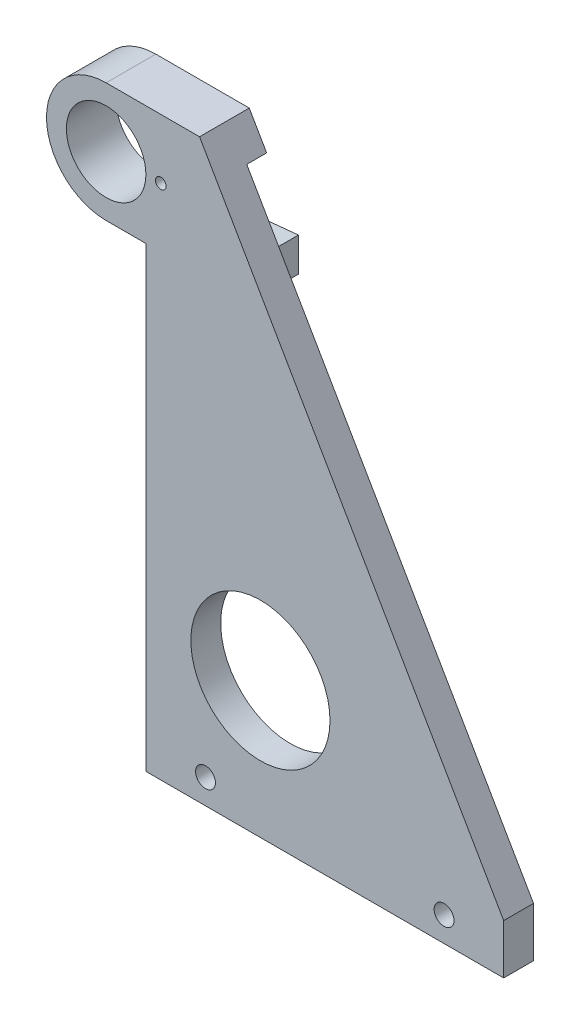
ISO-10303-21;
HEADER;
FILE_DESCRIPTION(('STEP AP214'),'2;1');
FILE_NAME('part.step','',(''),(''),'','','');
FILE_SCHEMA(('AUTOMOTIVE_DESIGN { 1 0 10303 214 1 1 1 1 }'));
ENDSEC;
DATA;
#1=APPLICATION_CONTEXT('core data for automotive mechanical design processes');
#2=APPLICATION_PROTOCOL_DEFINITION('international standard','automotive_design',2000,#1);
#3=PRODUCT_CONTEXT('',#1,'mechanical');
#4=PRODUCT('Part','Part','',(#3));
#5=PRODUCT_RELATED_PRODUCT_CATEGORY('part','',(#4));
#6=PRODUCT_DEFINITION_FORMATION('','',#4);
#7=PRODUCT_DEFINITION_CONTEXT('part definition',#1,'design');
#8=PRODUCT_DEFINITION('design','',#6,#7);
#9=PRODUCT_DEFINITION_SHAPE('','',#8);
#10=(LENGTH_UNIT() NAMED_UNIT(*) SI_UNIT(.MILLI.,.METRE.));
#11=(NAMED_UNIT(*) PLANE_ANGLE_UNIT() SI_UNIT($,.RADIAN.));
#12=(NAMED_UNIT(*) SI_UNIT($,.STERADIAN.) SOLID_ANGLE_UNIT());
#13=UNCERTAINTY_MEASURE_WITH_UNIT(LENGTH_MEASURE(1.E-05),#10,'distance_accuracy_value','');
#14=(GEOMETRIC_REPRESENTATION_CONTEXT(3) GLOBAL_UNCERTAINTY_ASSIGNED_CONTEXT((#13)) GLOBAL_UNIT_ASSIGNED_CONTEXT((#10,
#11,#12)) REPRESENTATION_CONTEXT('',''));
#15=CARTESIAN_POINT('',(0.,0.,0.));
#16=DIRECTION('',(0.,0.,1.));
#17=DIRECTION('',(1.,0.,0.));
#18=AXIS2_PLACEMENT_3D('',#15,#16,#17);
#19=CARTESIAN_POINT('',(12.,2.49999999999995,0.));
#20=DIRECTION('',(0.,0.,1.));
#21=DIRECTION('',(1.,0.,0.));
#22=AXIS2_PLACEMENT_3D('',#19,#20,#21);
#23=CYLINDRICAL_SURFACE('',#22,1.);
#24=CARTESIAN_POINT('',(12.,2.49999999999995,3.));
#25=DIRECTION('',(0.,0.,1.));
#26=DIRECTION('',(1.,0.,0.));
#27=AXIS2_PLACEMENT_3D('',#24,#25,#26);
#28=CIRCLE('',#27,1.);
#29=CARTESIAN_POINT('',(13.,2.49999999999995,3.));
#30=VERTEX_POINT('',#29);
#31=EDGE_CURVE('E182',#30,#30,#28,.T.);
#32=ORIENTED_EDGE('',*,*,#31,.T.);
#33=EDGE_LOOP('',(#32));
#34=FACE_BOUND('',#33,.T.);
#35=CARTESIAN_POINT('',(12.,2.49999999999995,1.5));
#36=DIRECTION('',(0.,0.,-1.));
#37=DIRECTION('',(-1.,0.,0.));
#38=AXIS2_PLACEMENT_3D('',#35,#36,#37);
#39=CIRCLE('',#38,1.);
#40=CARTESIAN_POINT('',(11.,2.49999999999995,1.5));
#41=VERTEX_POINT('',#40);
#42=EDGE_CURVE('E46',#41,#41,#39,.F.);
#43=ORIENTED_EDGE('',*,*,#42,.F.);
#44=EDGE_LOOP('',(#43));
#45=FACE_BOUND('',#44,.T.);
#46=ADVANCED_FACE('F41',(#34,#45),#23,.F.);
#47=CARTESIAN_POINT('',(-12.,2.49999999999995,0.));
#48=DIRECTION('',(0.,0.,1.));
#49=DIRECTION('',(1.,0.,0.));
#50=AXIS2_PLACEMENT_3D('',#47,#48,#49);
#51=CYLINDRICAL_SURFACE('',#50,1.);
#52=CARTESIAN_POINT('',(-12.,2.49999999999995,3.));
#53=DIRECTION('',(0.,0.,1.));
#54=DIRECTION('',(-1.,0.,0.));
#55=AXIS2_PLACEMENT_3D('',#52,#53,#54);
#56=CIRCLE('',#55,1.);
#57=CARTESIAN_POINT('',(-13.,2.49999999999995,3.));
#58=VERTEX_POINT('',#57);
#59=EDGE_CURVE('E179',#58,#58,#56,.T.);
#60=ORIENTED_EDGE('',*,*,#59,.T.);
#61=EDGE_LOOP('',(#60));
#62=FACE_BOUND('',#61,.T.);
#63=CARTESIAN_POINT('',(-12.,2.49999999999995,1.5));
#64=DIRECTION('',(0.,0.,-1.));
#65=DIRECTION('',(-1.,0.,0.));
#66=AXIS2_PLACEMENT_3D('',#63,#64,#65);
#67=CIRCLE('',#66,1.);
#68=CARTESIAN_POINT('',(-13.,2.49999999999995,1.5));
#69=VERTEX_POINT('',#68);
#70=EDGE_CURVE('E230',#69,#69,#67,.F.);
#71=ORIENTED_EDGE('',*,*,#70,.F.);
#72=EDGE_LOOP('',(#71));
#73=FACE_BOUND('',#72,.T.);
#74=ADVANCED_FACE('F298',(#62,#73),#51,.F.);
#75=CARTESIAN_POINT('',(-22.,52.,0.));
#76=DIRECTION('',(0.,0.,-1.));
#77=DIRECTION('',(-1.,0.,0.));
#78=AXIS2_PLACEMENT_3D('',#75,#76,#77);
#79=CYLINDRICAL_SURFACE('',#78,6.00000000000001);
#80=DIRECTION('',(0.,0.,-1.));
#81=VECTOR('',#80,1.);
#82=CARTESIAN_POINT('',(-22.,58.,3.));
#83=LINE('',#82,#81);
#84=CARTESIAN_POINT('',(-22.,58.,-2.));
#85=VERTEX_POINT('',#84);
#86=CARTESIAN_POINT('',(-22.,58.,3.));
#87=VERTEX_POINT('',#86);
#88=EDGE_CURVE('E225',#85,#87,#83,.F.);
#89=ORIENTED_EDGE('',*,*,#88,.F.);
#90=CARTESIAN_POINT('',(-22.,52.,-2.));
#91=DIRECTION('',(0.,0.,-1.));
#92=DIRECTION('',(-1.,0.,0.));
#93=AXIS2_PLACEMENT_3D('',#90,#91,#92);
#94=CIRCLE('',#93,5.99999999999999);
#95=CARTESIAN_POINT('',(-22.,46.,-2.));
#96=VERTEX_POINT('',#95);
#97=EDGE_CURVE('E161',#96,#85,#94,.T.);
#98=ORIENTED_EDGE('',*,*,#97,.F.);
#99=DIRECTION('',(0.,0.,-1.));
#100=VECTOR('',#99,1.);
#101=CARTESIAN_POINT('',(-22.,46.,3.));
#102=LINE('',#101,#100);
#103=CARTESIAN_POINT('',(-22.,46.,3.));
#104=VERTEX_POINT('',#103);
#105=EDGE_CURVE('E228',#104,#96,#102,.T.);
#106=ORIENTED_EDGE('',*,*,#105,.F.);
#107=CARTESIAN_POINT('',(-22.,52.,3.));
#108=DIRECTION('',(0.,0.,-1.));
#109=DIRECTION('',(-1.,0.,0.));
#110=AXIS2_PLACEMENT_3D('',#107,#108,#109);
#111=CIRCLE('',#110,6.00000000000001);
#112=EDGE_CURVE('E51',#87,#104,#111,.F.);
#113=ORIENTED_EDGE('',*,*,#112,.F.);
#114=EDGE_LOOP('',(#89,#98,#106,#113));
#115=FACE_BOUND('',#114,.T.);
#116=ADVANCED_FACE('F44',(#115),#79,.T.);
#117=CARTESIAN_POINT('',(-28.,46.,3.));
#118=DIRECTION('',(0.,1.,0.));
#119=DIRECTION('',(-1.,0.,0.));
#120=AXIS2_PLACEMENT_3D('',#117,#118,#119);
#121=PLANE('',#120);
#122=DIRECTION('',(1.,0.,0.));
#123=VECTOR('',#122,1.);
#124=CARTESIAN_POINT('',(-28.,46.,3.));
#125=LINE('',#124,#123);
#126=CARTESIAN_POINT('',(-18.,46.,3.));
#127=VERTEX_POINT('',#126);
#128=EDGE_CURVE('E192',#104,#127,#125,.T.);
#129=ORIENTED_EDGE('',*,*,#128,.F.);
#130=ORIENTED_EDGE('',*,*,#105,.T.);
#131=DIRECTION('',(-1.,0.,0.));
#132=VECTOR('',#131,1.);
#133=CARTESIAN_POINT('',(-7.65080762605154,46.,-2.));
#134=LINE('',#133,#132);
#135=CARTESIAN_POINT('',(-7.65080762605154,46.,-2.));
#136=VERTEX_POINT('',#135);
#137=EDGE_CURVE('E171',#136,#96,#134,.T.);
#138=ORIENTED_EDGE('',*,*,#137,.F.);
#139=DIRECTION('',(0.,0.,1.));
#140=VECTOR('',#139,1.);
#141=CARTESIAN_POINT('',(-7.65080762605154,46.,-2.));
#142=LINE('',#141,#140);
#143=CARTESIAN_POINT('',(-7.65080762605154,46.,0.));
#144=VERTEX_POINT('',#143);
#145=EDGE_CURVE('E173',#136,#144,#142,.T.);
#146=ORIENTED_EDGE('',*,*,#145,.T.);
#147=DIRECTION('',(-1.,0.,0.));
#148=VECTOR('',#147,1.);
#149=CARTESIAN_POINT('',(-7.65080762605154,46.,0.));
#150=LINE('',#149,#148);
#151=CARTESIAN_POINT('',(-18.,46.,0.));
#152=VERTEX_POINT('',#151);
#153=EDGE_CURVE('E153',#144,#152,#150,.T.);
#154=ORIENTED_EDGE('',*,*,#153,.T.);
#155=DIRECTION('',(0.,0.,-1.));
#156=VECTOR('',#155,1.);
#157=CARTESIAN_POINT('',(-18.,46.,3.));
#158=LINE('',#157,#156);
#159=EDGE_CURVE('E222',#127,#152,#158,.T.);
#160=ORIENTED_EDGE('',*,*,#159,.F.);
#161=EDGE_LOOP('',(#129,#130,#138,#146,#154,#160));
#162=FACE_BOUND('',#161,.T.);
#163=ADVANCED_FACE('F332',(#162),#121,.F.);
#164=CARTESIAN_POINT('',(-18.,46.,3.));
#165=DIRECTION('',(1.,0.,0.));
#166=DIRECTION('',(0.,1.,0.));
#167=AXIS2_PLACEMENT_3D('',#164,#165,#166);
#168=PLANE('',#167);
#169=DIRECTION('',(0.,-1.,0.));
#170=VECTOR('',#169,1.);
#171=CARTESIAN_POINT('',(-18.,46.,0.));
#172=LINE('',#171,#170);
#173=CARTESIAN_POINT('',(-18.,0.,0.));
#174=VERTEX_POINT('',#173);
#175=EDGE_CURVE('E189',#152,#174,#172,.T.);
#176=ORIENTED_EDGE('',*,*,#175,.T.);
#177=DIRECTION('',(0.,0.,-1.));
#178=VECTOR('',#177,1.);
#179=CARTESIAN_POINT('',(-18.,0.,3.));
#180=LINE('',#179,#178);
#181=CARTESIAN_POINT('',(-18.,0.,3.));
#182=VERTEX_POINT('',#181);
#183=EDGE_CURVE('E219',#182,#174,#180,.T.);
#184=ORIENTED_EDGE('',*,*,#183,.F.);
#185=DIRECTION('',(0.,-1.,0.));
#186=VECTOR('',#185,1.);
#187=CARTESIAN_POINT('',(-18.,46.,3.));
#188=LINE('',#187,#186);
#189=EDGE_CURVE('E194',#127,#182,#188,.T.);
#190=ORIENTED_EDGE('',*,*,#189,.F.);
#191=ORIENTED_EDGE('',*,*,#159,.T.);
#192=EDGE_LOOP('',(#176,#184,#190,#191));
#193=FACE_BOUND('',#192,.T.);
#194=ADVANCED_FACE('F329',(#193),#168,.F.);
#195=CARTESIAN_POINT('',(-18.,0.,3.));
#196=DIRECTION('',(0.,1.,0.));
#197=DIRECTION('',(-1.,0.,0.));
#198=AXIS2_PLACEMENT_3D('',#195,#196,#197);
#199=PLANE('',#198);
#200=DIRECTION('',(1.,0.,0.));
#201=VECTOR('',#200,1.);
#202=CARTESIAN_POINT('',(-18.,0.,0.));
#203=LINE('',#202,#201);
#204=CARTESIAN_POINT('',(18.,0.,0.));
#205=VERTEX_POINT('',#204);
#206=EDGE_CURVE('E207',#174,#205,#203,.T.);
#207=ORIENTED_EDGE('',*,*,#206,.T.);
#208=DIRECTION('',(0.,0.,-1.));
#209=VECTOR('',#208,1.);
#210=CARTESIAN_POINT('',(18.,0.,3.));
#211=LINE('',#210,#209);
#212=CARTESIAN_POINT('',(18.,0.,3.));
#213=VERTEX_POINT('',#212);
#214=EDGE_CURVE('E216',#213,#205,#211,.T.);
#215=ORIENTED_EDGE('',*,*,#214,.F.);
#216=DIRECTION('',(1.,0.,0.));
#217=VECTOR('',#216,1.);
#218=CARTESIAN_POINT('',(-18.,0.,3.));
#219=LINE('',#218,#217);
#220=EDGE_CURVE('E197',#182,#213,#219,.T.);
#221=ORIENTED_EDGE('',*,*,#220,.F.);
#222=ORIENTED_EDGE('',*,*,#183,.T.);
#223=EDGE_LOOP('',(#207,#215,#221,#222));
#224=FACE_BOUND('',#223,.T.);
#225=ADVANCED_FACE('F326',(#224),#199,.F.);
#226=CARTESIAN_POINT('',(18.,0.,3.));
#227=DIRECTION('',(-1.,0.,0.));
#228=DIRECTION('',(0.,0.,1.));
#229=AXIS2_PLACEMENT_3D('',#226,#227,#228);
#230=PLANE('',#229);
#231=DIRECTION('',(0.,1.,0.));
#232=VECTOR('',#231,1.);
#233=CARTESIAN_POINT('',(18.,0.,0.));
#234=LINE('',#233,#232);
#235=CARTESIAN_POINT('',(18.,5.00000000000001,0.));
#236=VERTEX_POINT('',#235);
#237=EDGE_CURVE('E209',#205,#236,#234,.T.);
#238=ORIENTED_EDGE('',*,*,#237,.T.);
#239=DIRECTION('',(0.,0.,-1.));
#240=VECTOR('',#239,1.);
#241=CARTESIAN_POINT('',(18.,5.00000000000001,3.));
#242=LINE('',#241,#240);
#243=CARTESIAN_POINT('',(18.,5.00000000000001,3.));
#244=VERTEX_POINT('',#243);
#245=EDGE_CURVE('E213',#244,#236,#242,.T.);
#246=ORIENTED_EDGE('',*,*,#245,.F.);
#247=DIRECTION('',(0.,1.,0.));
#248=VECTOR('',#247,1.);
#249=CARTESIAN_POINT('',(18.,0.,3.));
#250=LINE('',#249,#248);
#251=EDGE_CURVE('E199',#213,#244,#250,.T.);
#252=ORIENTED_EDGE('',*,*,#251,.F.);
#253=ORIENTED_EDGE('',*,*,#214,.T.);
#254=EDGE_LOOP('',(#238,#246,#252,#253));
#255=FACE_BOUND('',#254,.T.);
#256=ADVANCED_FACE('F281',(#255),#230,.F.);
#257=CARTESIAN_POINT('',(18.,5.00000000000001,3.));
#258=DIRECTION('',(-0.866025403784443,-0.499999999999992,0.));
#259=DIRECTION('',(0.499999999999992,-0.866025403784443,0.));
#260=AXIS2_PLACEMENT_3D('',#257,#258,#259);
#261=PLANE('',#260);
#262=DIRECTION('',(-0.499999999999992,0.866025403784443,0.));
#263=VECTOR('',#262,1.);
#264=CARTESIAN_POINT('',(18.,5.00000000000001,0.));
#265=LINE('',#264,#263);
#266=CARTESIAN_POINT('',(-10.8495659914225,54.968914073456,0.));
#267=VERTEX_POINT('',#266);
#268=EDGE_CURVE('E195',#236,#267,#265,.T.);
#269=ORIENTED_EDGE('',*,*,#268,.T.);
#270=DIRECTION('',(0.,0.,-1.));
#271=VECTOR('',#270,1.);
#272=CARTESIAN_POINT('',(-10.8495659914225,54.968914073456,3.));
#273=LINE('',#272,#271);
#274=CARTESIAN_POINT('',(-10.8495659914225,54.968914073456,-2.));
#275=VERTEX_POINT('',#274);
#276=EDGE_CURVE('E156',#267,#275,#273,.T.);
#277=ORIENTED_EDGE('',*,*,#276,.T.);
#278=DIRECTION('',(0.5,-0.866025403784439,0.));
#279=VECTOR('',#278,1.);
#280=CARTESIAN_POINT('',(-12.5995642670495,58.,-2.));
#281=LINE('',#280,#279);
#282=CARTESIAN_POINT('',(-12.5995642670495,58.,-2.));
#283=VERTEX_POINT('',#282);
#284=EDGE_CURVE('E167',#283,#275,#281,.T.);
#285=ORIENTED_EDGE('',*,*,#284,.F.);
#286=DIRECTION('',(0.,0.,-1.));
#287=VECTOR('',#286,1.);
#288=CARTESIAN_POINT('',(-12.5995642670495,58.,3.));
#289=LINE('',#288,#287);
#290=CARTESIAN_POINT('',(-12.5995642670495,58.,3.));
#291=VERTEX_POINT('',#290);
#292=EDGE_CURVE('E205',#291,#283,#289,.T.);
#293=ORIENTED_EDGE('',*,*,#292,.F.);
#294=DIRECTION('',(-0.499999999999992,0.866025403784443,0.));
#295=VECTOR('',#294,1.);
#296=CARTESIAN_POINT('',(18.,5.00000000000001,3.));
#297=LINE('',#296,#295);
#298=EDGE_CURVE('E201',#244,#291,#297,.T.);
#299=ORIENTED_EDGE('',*,*,#298,.F.);
#300=ORIENTED_EDGE('',*,*,#245,.T.);
#301=EDGE_LOOP('',(#269,#277,#285,#293,#299,#300));
#302=FACE_BOUND('',#301,.T.);
#303=ADVANCED_FACE('F264',(#302),#261,.F.);
#304=CARTESIAN_POINT('',(-12.5995642670495,58.,3.));
#305=DIRECTION('',(0.,-1.,0.));
#306=DIRECTION('',(1.,0.,0.));
#307=AXIS2_PLACEMENT_3D('',#304,#305,#306);
#308=PLANE('',#307);
#309=ORIENTED_EDGE('',*,*,#292,.T.);
#310=DIRECTION('',(1.,0.,0.));
#311=VECTOR('',#310,1.);
#312=CARTESIAN_POINT('',(-22.,58.,-2.));
#313=LINE('',#312,#311);
#314=EDGE_CURVE('E164',#85,#283,#313,.T.);
#315=ORIENTED_EDGE('',*,*,#314,.F.);
#316=ORIENTED_EDGE('',*,*,#88,.T.);
#317=DIRECTION('',(-1.,0.,0.));
#318=VECTOR('',#317,1.);
#319=CARTESIAN_POINT('',(-12.5995642670495,58.,3.));
#320=LINE('',#319,#318);
#321=EDGE_CURVE('E203',#291,#87,#320,.T.);
#322=ORIENTED_EDGE('',*,*,#321,.F.);
#323=EDGE_LOOP('',(#309,#315,#316,#322));
#324=FACE_BOUND('',#323,.T.);
#325=ADVANCED_FACE('F272',(#324),#308,.F.);
#326=CARTESIAN_POINT('',(0.,0.,3.));
#327=DIRECTION('',(0.,0.,-1.));
#328=DIRECTION('',(-1.,0.,0.));
#329=AXIS2_PLACEMENT_3D('',#326,#327,#328);
#330=PLANE('',#329);
#331=CARTESIAN_POINT('',(-16.5,52.,3.));
#332=DIRECTION('',(0.,0.,-1.));
#333=DIRECTION('',(-1.,0.,0.));
#334=AXIS2_PLACEMENT_3D('',#331,#332,#333);
#335=CIRCLE('',#334,0.53714125745292);
#336=CARTESIAN_POINT('',(-17.0371412574529,52.,3.));
#337=VERTEX_POINT('',#336);
#338=EDGE_CURVE('E237',#337,#337,#335,.T.);
#339=ORIENTED_EDGE('',*,*,#338,.T.);
#340=EDGE_LOOP('',(#339));
#341=FACE_BOUND('',#340,.T.);
#342=CARTESIAN_POINT('',(-22.,52.,3.));
#343=DIRECTION('',(0.,0.,1.));
#344=DIRECTION('',(1.,0.,0.));
#345=AXIS2_PLACEMENT_3D('',#342,#343,#344);
#346=CIRCLE('',#345,4.);
#347=CARTESIAN_POINT('',(-18.,52.,3.));
#348=VERTEX_POINT('',#347);
#349=EDGE_CURVE('E151',#348,#348,#346,.T.);
#350=ORIENTED_EDGE('',*,*,#349,.F.);
#351=EDGE_LOOP('',(#350));
#352=FACE_BOUND('',#351,.T.);
#353=ORIENTED_EDGE('',*,*,#59,.F.);
#354=EDGE_LOOP('',(#353));
#355=FACE_BOUND('',#354,.T.);
#356=ORIENTED_EDGE('',*,*,#31,.F.);
#357=EDGE_LOOP('',(#356));
#358=FACE_BOUND('',#357,.T.);
#359=CARTESIAN_POINT('',(-6.47635753390574,13.6875392105491,3.));
#360=DIRECTION('',(0.,0.,1.));
#361=DIRECTION('',(1.,0.,0.));
#362=AXIS2_PLACEMENT_3D('',#359,#360,#361);
#363=CIRCLE('',#362,7.);
#364=CARTESIAN_POINT('',(0.523642466094258,13.6875392105491,3.));
#365=VERTEX_POINT('',#364);
#366=EDGE_CURVE('E185',#365,#365,#363,.T.);
#367=ORIENTED_EDGE('',*,*,#366,.F.);
#368=EDGE_LOOP('',(#367));
#369=FACE_BOUND('',#368,.T.);
#370=ORIENTED_EDGE('',*,*,#321,.T.);
#371=ORIENTED_EDGE('',*,*,#112,.T.);
#372=ORIENTED_EDGE('',*,*,#128,.T.);
#373=ORIENTED_EDGE('',*,*,#189,.T.);
#374=ORIENTED_EDGE('',*,*,#220,.T.);
#375=ORIENTED_EDGE('',*,*,#251,.T.);
#376=ORIENTED_EDGE('',*,*,#298,.T.);
#377=EDGE_LOOP('',(#370,#371,#372,#373,#374,#375,#376));
#378=FACE_BOUND('',#377,.T.);
#379=ADVANCED_FACE('F276',(#341,#352,#355,#358,#369,#378),#330,.F.);
#380=CARTESIAN_POINT('',(0.,0.,0.));
#381=DIRECTION('',(0.,0.,-1.));
#382=DIRECTION('',(-1.,0.,0.));
#383=AXIS2_PLACEMENT_3D('',#380,#381,#382);
#384=PLANE('',#383);
#385=CARTESIAN_POINT('',(12.,2.49999999999995,0.));
#386=DIRECTION('',(0.,0.,-1.));
#387=DIRECTION('',(-1.,0.,0.));
#388=AXIS2_PLACEMENT_3D('',#385,#386,#387);
#389=CIRCLE('',#388,1.85);
#390=CARTESIAN_POINT('',(10.15,2.49999999999995,0.));
#391=VERTEX_POINT('',#390);
#392=EDGE_CURVE('E247',#391,#391,#389,.T.);
#393=ORIENTED_EDGE('',*,*,#392,.F.);
#394=EDGE_LOOP('',(#393));
#395=FACE_BOUND('',#394,.T.);
#396=CARTESIAN_POINT('',(-12.,2.49999999999995,0.));
#397=DIRECTION('',(0.,0.,-1.));
#398=DIRECTION('',(-1.,0.,0.));
#399=AXIS2_PLACEMENT_3D('',#396,#397,#398);
#400=CIRCLE('',#399,1.85);
#401=CARTESIAN_POINT('',(-13.85,2.49999999999995,0.));
#402=VERTEX_POINT('',#401);
#403=EDGE_CURVE('E240',#402,#402,#400,.T.);
#404=ORIENTED_EDGE('',*,*,#403,.F.);
#405=EDGE_LOOP('',(#404));
#406=FACE_BOUND('',#405,.T.);
#407=CARTESIAN_POINT('',(-16.5,52.,0.));
#408=DIRECTION('',(0.,0.,-1.));
#409=DIRECTION('',(-1.,0.,0.));
#410=AXIS2_PLACEMENT_3D('',#407,#408,#409);
#411=CIRCLE('',#410,0.53714125745292);
#412=CARTESIAN_POINT('',(-17.0371412574529,52.,0.));
#413=VERTEX_POINT('',#412);
#414=EDGE_CURVE('E232',#413,#413,#411,.T.);
#415=ORIENTED_EDGE('',*,*,#414,.F.);
#416=EDGE_LOOP('',(#415));
#417=FACE_BOUND('',#416,.T.);
#418=DIRECTION('',(0.,-1.,0.));
#419=VECTOR('',#418,1.);
#420=CARTESIAN_POINT('',(-7.65080762605154,49.4285020634976,0.));
#421=LINE('',#420,#419);
#422=CARTESIAN_POINT('',(-7.65080762605154,49.411277283696,0.));
#423=VERTEX_POINT('',#422);
#424=EDGE_CURVE('E150',#423,#144,#421,.T.);
#425=ORIENTED_EDGE('',*,*,#424,.F.);
#426=DIRECTION('',(0.995236674910504,0.0974882603859777,0.));
#427=VECTOR('',#426,1.);
#428=CARTESIAN_POINT('',(-21.1704655784035,48.0869612008841,0.));
#429=LINE('',#428,#427);
#430=CARTESIAN_POINT('',(-21.1704655784035,48.0869612008841,0.));
#431=VERTEX_POINT('',#430);
#432=EDGE_CURVE('E252',#431,#423,#429,.T.);
#433=ORIENTED_EDGE('',*,*,#432,.F.);
#434=CARTESIAN_POINT('',(-22.,52.,0.));
#435=DIRECTION('',(0.,0.,-1.));
#436=DIRECTION('',(-1.,0.,0.));
#437=AXIS2_PLACEMENT_3D('',#434,#435,#436);
#438=CIRCLE('',#437,4.);
#439=CARTESIAN_POINT('',(-21.1704655784035,55.9130387991159,0.));
#440=VERTEX_POINT('',#439);
#441=EDGE_CURVE('E11',#431,#440,#438,.F.);
#442=ORIENTED_EDGE('',*,*,#441,.T.);
#443=DIRECTION('',(-0.995842058298818,0.0910966241041536,0.));
#444=VECTOR('',#443,1.);
#445=CARTESIAN_POINT('',(-7.02133985441123,54.6187195074776,0.));
#446=LINE('',#445,#444);
#447=EDGE_CURVE('E254',#267,#440,#446,.T.);
#448=ORIENTED_EDGE('',*,*,#447,.F.);
#449=ORIENTED_EDGE('',*,*,#268,.F.);
#450=ORIENTED_EDGE('',*,*,#237,.F.);
#451=ORIENTED_EDGE('',*,*,#206,.F.);
#452=ORIENTED_EDGE('',*,*,#175,.F.);
#453=ORIENTED_EDGE('',*,*,#153,.F.);
#454=EDGE_LOOP('',(#425,#433,#442,#448,#449,#450,#451,#452,#453));
#455=FACE_BOUND('',#454,.T.);
#456=CARTESIAN_POINT('',(-6.47635753390574,13.6875392105491,0.));
#457=DIRECTION('',(0.,0.,1.));
#458=DIRECTION('',(1.,0.,0.));
#459=AXIS2_PLACEMENT_3D('',#456,#457,#458);
#460=CIRCLE('',#459,7.);
#461=CARTESIAN_POINT('',(0.523642466094258,13.6875392105491,0.));
#462=VERTEX_POINT('',#461);
#463=EDGE_CURVE('E186',#462,#462,#460,.T.);
#464=ORIENTED_EDGE('',*,*,#463,.T.);
#465=EDGE_LOOP('',(#464));
#466=FACE_BOUND('',#465,.T.);
#467=ADVANCED_FACE('F285',(#395,#406,#417,#455,#466),#384,.T.);
#468=CARTESIAN_POINT('',(-6.47635753390574,13.6875392105491,0.));
#469=DIRECTION('',(0.,0.,1.));
#470=DIRECTION('',(1.,0.,0.));
#471=AXIS2_PLACEMENT_3D('',#468,#469,#470);
#472=CYLINDRICAL_SURFACE('',#471,7.);
#473=ORIENTED_EDGE('',*,*,#463,.F.);
#474=EDGE_LOOP('',(#473));
#475=FACE_BOUND('',#474,.T.);
#476=ORIENTED_EDGE('',*,*,#366,.T.);
#477=EDGE_LOOP('',(#476));
#478=FACE_BOUND('',#477,.T.);
#479=ADVANCED_FACE('F309',(#475,#478),#472,.F.);
#480=CARTESIAN_POINT('',(-7.65080762605154,49.4285020634976,-2.));
#481=DIRECTION('',(-1.,0.,0.));
#482=DIRECTION('',(0.,0.,1.));
#483=AXIS2_PLACEMENT_3D('',#480,#481,#482);
#484=PLANE('',#483);
#485=DIRECTION('',(0.,-1.,0.));
#486=VECTOR('',#485,1.);
#487=CARTESIAN_POINT('',(-7.65080762605154,49.4285020634976,-2.));
#488=LINE('',#487,#486);
#489=CARTESIAN_POINT('',(-7.65080762605154,49.411277283696,-2.));
#490=VERTEX_POINT('',#489);
#491=EDGE_CURVE('E169',#490,#136,#488,.T.);
#492=ORIENTED_EDGE('',*,*,#491,.F.);
#493=DIRECTION('',(0.,0.,1.));
#494=VECTOR('',#493,1.);
#495=CARTESIAN_POINT('',(-7.65080762605154,49.411277283696,-2.));
#496=LINE('',#495,#494);
#497=EDGE_CURVE('E132',#490,#423,#496,.T.);
#498=ORIENTED_EDGE('',*,*,#497,.T.);
#499=ORIENTED_EDGE('',*,*,#424,.T.);
#500=ORIENTED_EDGE('',*,*,#145,.F.);
#501=EDGE_LOOP('',(#492,#498,#499,#500));
#502=FACE_BOUND('',#501,.T.);
#503=ADVANCED_FACE('F312',(#502),#484,.F.);
#504=CARTESIAN_POINT('',(-22.,52.,-2.));
#505=DIRECTION('',(0.,0.,-1.));
#506=DIRECTION('',(-1.,0.,0.));
#507=AXIS2_PLACEMENT_3D('',#504,#505,#506);
#508=PLANE('',#507);
#509=DIRECTION('',(0.995842058298818,-0.0910966241041536,0.));
#510=VECTOR('',#509,1.);
#511=CARTESIAN_POINT('',(-7.02133985441123,54.6187195074776,-2.));
#512=LINE('',#511,#510);
#513=CARTESIAN_POINT('',(-21.1704655784035,55.9130387991159,-2.));
#514=VERTEX_POINT('',#513);
#515=EDGE_CURVE('E136',#514,#275,#512,.T.);
#516=ORIENTED_EDGE('',*,*,#515,.F.);
#517=CARTESIAN_POINT('',(-22.,52.,-2.));
#518=DIRECTION('',(0.,0.,1.));
#519=DIRECTION('',(1.,0.,0.));
#520=AXIS2_PLACEMENT_3D('',#517,#518,#519);
#521=CIRCLE('',#520,4.);
#522=CARTESIAN_POINT('',(-21.1704655784035,48.0869612008841,-2.));
#523=VERTEX_POINT('',#522);
#524=EDGE_CURVE('E144',#514,#523,#521,.T.);
#525=ORIENTED_EDGE('',*,*,#524,.T.);
#526=DIRECTION('',(-0.995236674910504,-0.0974882603859777,0.));
#527=VECTOR('',#526,1.);
#528=CARTESIAN_POINT('',(-21.1704655784035,48.0869612008841,-2.));
#529=LINE('',#528,#527);
#530=EDGE_CURVE('E129',#490,#523,#529,.T.);
#531=ORIENTED_EDGE('',*,*,#530,.F.);
#532=ORIENTED_EDGE('',*,*,#491,.T.);
#533=ORIENTED_EDGE('',*,*,#137,.T.);
#534=ORIENTED_EDGE('',*,*,#97,.T.);
#535=ORIENTED_EDGE('',*,*,#314,.T.);
#536=ORIENTED_EDGE('',*,*,#284,.T.);
#537=EDGE_LOOP('',(#516,#525,#531,#532,#533,#534,#535,#536));
#538=FACE_BOUND('',#537,.T.);
#539=ADVANCED_FACE('F148',(#538),#508,.T.);
#540=CARTESIAN_POINT('',(-22.,52.,-2.));
#541=DIRECTION('',(0.,0.,1.));
#542=DIRECTION('',(1.,0.,0.));
#543=AXIS2_PLACEMENT_3D('',#540,#541,#542);
#544=CYLINDRICAL_SURFACE('',#543,4.);
#545=ORIENTED_EDGE('',*,*,#524,.F.);
#546=DIRECTION('',(0.,0.,-1.));
#547=VECTOR('',#546,1.);
#548=CARTESIAN_POINT('',(-21.1704655784035,55.9130387991159,16.1692686701312));
#549=LINE('',#548,#547);
#550=EDGE_CURVE('E145',#440,#514,#549,.T.);
#551=ORIENTED_EDGE('',*,*,#550,.F.);
#552=ORIENTED_EDGE('',*,*,#441,.F.);
#553=DIRECTION('',(0.,0.,-1.));
#554=VECTOR('',#553,1.);
#555=CARTESIAN_POINT('',(-21.1704655784035,48.0869612008841,16.1692686701312));
#556=LINE('',#555,#554);
#557=EDGE_CURVE('E59',#431,#523,#556,.T.);
#558=ORIENTED_EDGE('',*,*,#557,.T.);
#559=EDGE_LOOP('',(#545,#551,#552,#558));
#560=FACE_BOUND('',#559,.T.);
#561=ORIENTED_EDGE('',*,*,#349,.T.);
#562=EDGE_LOOP('',(#561));
#563=FACE_BOUND('',#562,.T.);
#564=ADVANCED_FACE('F141',(#560,#563),#544,.F.);
#565=CARTESIAN_POINT('',(-7.02133985441123,54.6187195074776,16.1692686701312));
#566=DIRECTION('',(0.0910966241041536,0.995842058298818,0.));
#567=DIRECTION('',(-0.995842058298818,0.0910966241041536,0.));
#568=AXIS2_PLACEMENT_3D('',#565,#566,#567);
#569=PLANE('',#568);
#570=ORIENTED_EDGE('',*,*,#447,.T.);
#571=ORIENTED_EDGE('',*,*,#550,.T.);
#572=ORIENTED_EDGE('',*,*,#515,.T.);
#573=ORIENTED_EDGE('',*,*,#276,.F.);
#574=EDGE_LOOP('',(#570,#571,#572,#573));
#575=FACE_BOUND('',#574,.T.);
#576=ADVANCED_FACE('F287',(#575),#569,.F.);
#577=CARTESIAN_POINT('',(-21.1704655784035,48.0869612008841,16.1692686701312));
#578=DIRECTION('',(0.0974882603859777,-0.995236674910504,0.));
#579=DIRECTION('',(0.995236674910504,0.0974882603859777,0.));
#580=AXIS2_PLACEMENT_3D('',#577,#578,#579);
#581=PLANE('',#580);
#582=ORIENTED_EDGE('',*,*,#530,.T.);
#583=ORIENTED_EDGE('',*,*,#557,.F.);
#584=ORIENTED_EDGE('',*,*,#432,.T.);
#585=ORIENTED_EDGE('',*,*,#497,.F.);
#586=EDGE_LOOP('',(#582,#583,#584,#585));
#587=FACE_BOUND('',#586,.T.);
#588=ADVANCED_FACE('F130',(#587),#581,.F.);
#589=CARTESIAN_POINT('',(-16.5,52.,3.));
#590=DIRECTION('',(0.,0.,-1.));
#591=DIRECTION('',(-1.,0.,0.));
#592=AXIS2_PLACEMENT_3D('',#589,#590,#591);
#593=CYLINDRICAL_SURFACE('',#592,0.53714125745292);
#594=ORIENTED_EDGE('',*,*,#338,.F.);
#595=EDGE_LOOP('',(#594));
#596=FACE_BOUND('',#595,.T.);
#597=ORIENTED_EDGE('',*,*,#414,.T.);
#598=EDGE_LOOP('',(#597));
#599=FACE_BOUND('',#598,.T.);
#600=ADVANCED_FACE('F294',(#596,#599),#593,.F.);
#601=CARTESIAN_POINT('',(-12.,2.49999999999995,1.5));
#602=DIRECTION('',(0.,0.,-1.));
#603=DIRECTION('',(-1.,0.,0.));
#604=AXIS2_PLACEMENT_3D('',#601,#602,#603);
#605=PLANE('',#604);
#606=CARTESIAN_POINT('',(-12.,2.49999999999995,1.5));
#607=DIRECTION('',(0.,0.,-1.));
#608=DIRECTION('',(-1.,0.,0.));
#609=AXIS2_PLACEMENT_3D('',#606,#607,#608);
#610=CIRCLE('',#609,1.85);
#611=CARTESIAN_POINT('',(-13.85,2.49999999999995,1.5));
#612=VERTEX_POINT('',#611);
#613=EDGE_CURVE('E233',#612,#612,#610,.T.);
#614=ORIENTED_EDGE('',*,*,#613,.T.);
#615=EDGE_LOOP('',(#614));
#616=FACE_BOUND('',#615,.T.);
#617=ORIENTED_EDGE('',*,*,#70,.T.);
#618=EDGE_LOOP('',(#617));
#619=FACE_BOUND('',#618,.T.);
#620=ADVANCED_FACE('F389',(#616,#619),#605,.T.);
#621=CARTESIAN_POINT('',(-12.,2.49999999999995,1.5));
#622=DIRECTION('',(0.,0.,-1.));
#623=DIRECTION('',(-1.,0.,0.));
#624=AXIS2_PLACEMENT_3D('',#621,#622,#623);
#625=CYLINDRICAL_SURFACE('',#624,1.85);
#626=ORIENTED_EDGE('',*,*,#613,.F.);
#627=EDGE_LOOP('',(#626));
#628=FACE_BOUND('',#627,.T.);
#629=ORIENTED_EDGE('',*,*,#403,.T.);
#630=EDGE_LOOP('',(#629));
#631=FACE_BOUND('',#630,.T.);
#632=ADVANCED_FACE('F417',(#628,#631),#625,.F.);
#633=CARTESIAN_POINT('',(12.,2.49999999999995,1.5));
#634=DIRECTION('',(0.,0.,-1.));
#635=DIRECTION('',(-1.,0.,0.));
#636=AXIS2_PLACEMENT_3D('',#633,#634,#635);
#637=PLANE('',#636);
#638=CARTESIAN_POINT('',(12.,2.49999999999995,1.5));
#639=DIRECTION('',(0.,0.,-1.));
#640=DIRECTION('',(-1.,0.,0.));
#641=AXIS2_PLACEMENT_3D('',#638,#639,#640);
#642=CIRCLE('',#641,1.85);
#643=CARTESIAN_POINT('',(10.15,2.49999999999995,1.5));
#644=VERTEX_POINT('',#643);
#645=EDGE_CURVE('E460',#644,#644,#642,.T.);
#646=ORIENTED_EDGE('',*,*,#645,.T.);
#647=EDGE_LOOP('',(#646));
#648=FACE_BOUND('',#647,.T.);
#649=ORIENTED_EDGE('',*,*,#42,.T.);
#650=EDGE_LOOP('',(#649));
#651=FACE_BOUND('',#650,.T.);
#652=ADVANCED_FACE('F426',(#648,#651),#637,.T.);
#653=CARTESIAN_POINT('',(12.,2.49999999999995,1.5));
#654=DIRECTION('',(0.,0.,-1.));
#655=DIRECTION('',(-1.,0.,0.));
#656=AXIS2_PLACEMENT_3D('',#653,#654,#655);
#657=CYLINDRICAL_SURFACE('',#656,1.85);
#658=ORIENTED_EDGE('',*,*,#645,.F.);
#659=EDGE_LOOP('',(#658));
#660=FACE_BOUND('',#659,.T.);
#661=ORIENTED_EDGE('',*,*,#392,.T.);
#662=EDGE_LOOP('',(#661));
#663=FACE_BOUND('',#662,.T.);
#664=ADVANCED_FACE('F437',(#660,#663),#657,.F.);
#665=CLOSED_SHELL('',(#46,#74,#116,#163,#194,#225,#256,#303,#325,#379,#467,#479,#503,#539,#564,
#576,#588,#600,#620,#632,#652,#664));
#666=MANIFOLD_SOLID_BREP('B2',#665);
#667=ADVANCED_BREP_SHAPE_REPRESENTATION('',(#18,#666),#14);
#668=SHAPE_DEFINITION_REPRESENTATION(#9,#667);
ENDSEC;
END-ISO-10303-21;
